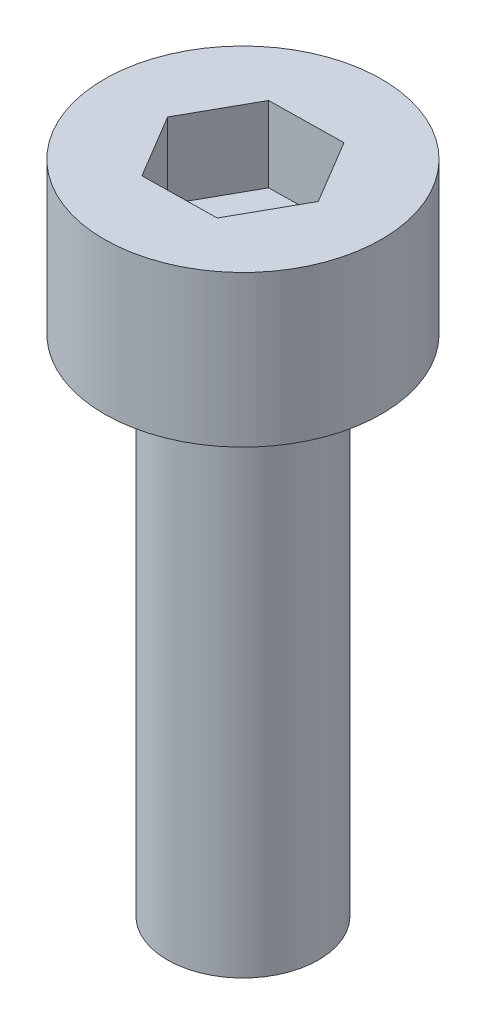
ISO-10303-21;
HEADER;
FILE_DESCRIPTION(('STEP AP214'),'2;1');
FILE_NAME('part.step','',(''),(''),'','','');
FILE_SCHEMA(('AUTOMOTIVE_DESIGN { 1 0 10303 214 1 1 1 1 }'));
ENDSEC;
DATA;
#1=APPLICATION_CONTEXT('core data for automotive mechanical design processes');
#2=APPLICATION_PROTOCOL_DEFINITION('international standard','automotive_design',2000,#1);
#3=PRODUCT_CONTEXT('',#1,'mechanical');
#4=PRODUCT('Part','Part','',(#3));
#5=PRODUCT_RELATED_PRODUCT_CATEGORY('part','',(#4));
#6=PRODUCT_DEFINITION_FORMATION('','',#4);
#7=PRODUCT_DEFINITION_CONTEXT('part definition',#1,'design');
#8=PRODUCT_DEFINITION('design','',#6,#7);
#9=PRODUCT_DEFINITION_SHAPE('','',#8);
#10=(LENGTH_UNIT() NAMED_UNIT(*) SI_UNIT(.MILLI.,.METRE.));
#11=(NAMED_UNIT(*) PLANE_ANGLE_UNIT() SI_UNIT($,.RADIAN.));
#12=(NAMED_UNIT(*) SI_UNIT($,.STERADIAN.) SOLID_ANGLE_UNIT());
#13=UNCERTAINTY_MEASURE_WITH_UNIT(LENGTH_MEASURE(1.E-05),#10,'distance_accuracy_value','');
#14=(GEOMETRIC_REPRESENTATION_CONTEXT(3) GLOBAL_UNCERTAINTY_ASSIGNED_CONTEXT((#13)) GLOBAL_UNIT_ASSIGNED_CONTEXT((#10,
#11,#12)) REPRESENTATION_CONTEXT('',''));
#15=CARTESIAN_POINT('',(0.,0.,0.));
#16=DIRECTION('',(0.,0.,1.));
#17=DIRECTION('',(1.,0.,0.));
#18=AXIS2_PLACEMENT_3D('',#15,#16,#17);
#19=CARTESIAN_POINT('',(0.,10.,0.));
#20=DIRECTION('',(0.,-1.,0.));
#21=DIRECTION('',(0.,0.,-1.));
#22=AXIS2_PLACEMENT_3D('',#19,#20,#21);
#23=CYLINDRICAL_SURFACE('',#22,1.5);
#24=CARTESIAN_POINT('',(0.,10.,0.));
#25=DIRECTION('',(0.,1.,0.));
#26=DIRECTION('',(0.,0.,1.));
#27=AXIS2_PLACEMENT_3D('',#24,#25,#26);
#28=CIRCLE('',#27,1.5);
#29=CARTESIAN_POINT('',(0.,10.,1.5));
#30=VERTEX_POINT('',#29);
#31=EDGE_CURVE('E11',#30,#30,#28,.T.);
#32=ORIENTED_EDGE('',*,*,#31,.F.);
#33=EDGE_LOOP('',(#32));
#34=FACE_BOUND('',#33,.T.);
#35=CARTESIAN_POINT('',(0.,0.,0.));
#36=DIRECTION('',(0.,1.,0.));
#37=DIRECTION('',(0.,0.,1.));
#38=AXIS2_PLACEMENT_3D('',#35,#36,#37);
#39=CIRCLE('',#38,1.5);
#40=CARTESIAN_POINT('',(0.,0.,1.5));
#41=VERTEX_POINT('',#40);
#42=EDGE_CURVE('E24',#41,#41,#39,.T.);
#43=ORIENTED_EDGE('',*,*,#42,.T.);
#44=EDGE_LOOP('',(#43));
#45=FACE_BOUND('',#44,.T.);
#46=ADVANCED_FACE('F17',(#34,#45),#23,.T.);
#47=CARTESIAN_POINT('',(0.,0.,0.));
#48=DIRECTION('',(0.,1.,0.));
#49=DIRECTION('',(0.,0.,1.));
#50=AXIS2_PLACEMENT_3D('',#47,#48,#49);
#51=PLANE('',#50);
#52=ORIENTED_EDGE('',*,*,#42,.F.);
#53=EDGE_LOOP('',(#52));
#54=FACE_BOUND('',#53,.T.);
#55=ADVANCED_FACE('F132',(#54),#51,.F.);
#56=CARTESIAN_POINT('',(0.,13.,0.));
#57=DIRECTION('',(0.,-1.,0.));
#58=DIRECTION('',(0.,0.,-1.));
#59=AXIS2_PLACEMENT_3D('',#56,#57,#58);
#60=CYLINDRICAL_SURFACE('',#59,2.75);
#61=CARTESIAN_POINT('',(0.,13.,0.));
#62=DIRECTION('',(0.,1.,0.));
#63=DIRECTION('',(0.,0.,1.));
#64=AXIS2_PLACEMENT_3D('',#61,#62,#63);
#65=CIRCLE('',#64,2.75);
#66=CARTESIAN_POINT('',(0.,13.,2.75));
#67=VERTEX_POINT('',#66);
#68=EDGE_CURVE('E126',#67,#67,#65,.T.);
#69=ORIENTED_EDGE('',*,*,#68,.F.);
#70=EDGE_LOOP('',(#69));
#71=FACE_BOUND('',#70,.T.);
#72=CARTESIAN_POINT('',(0.,10.,0.));
#73=DIRECTION('',(0.,1.,0.));
#74=DIRECTION('',(0.,0.,1.));
#75=AXIS2_PLACEMENT_3D('',#72,#73,#74);
#76=CIRCLE('',#75,2.75);
#77=CARTESIAN_POINT('',(0.,10.,2.75));
#78=VERTEX_POINT('',#77);
#79=EDGE_CURVE('E123',#78,#78,#76,.T.);
#80=ORIENTED_EDGE('',*,*,#79,.T.);
#81=EDGE_LOOP('',(#80));
#82=FACE_BOUND('',#81,.T.);
#83=ADVANCED_FACE('F134',(#71,#82),#60,.T.);
#84=CARTESIAN_POINT('',(0.,13.,0.));
#85=DIRECTION('',(0.,1.,0.));
#86=DIRECTION('',(0.,0.,1.));
#87=AXIS2_PLACEMENT_3D('',#84,#85,#86);
#88=PLANE('',#87);
#89=DIRECTION('',(0.999893086922528,0.,-0.0146224048821464));
#90=VECTOR('',#89,1.);
#91=CARTESIAN_POINT('',(-0.717399325967113,13.,1.28562755380473));
#92=LINE('',#91,#90);
#93=CARTESIAN_POINT('',(-0.717399325967113,13.,1.28562755380473));
#94=VERTEX_POINT('',#93);
#95=CARTESIAN_POINT('',(0.754686458416585,13.,1.26409981784772));
#96=VERTEX_POINT('',#95);
#97=EDGE_CURVE('E31',#94,#96,#92,.T.);
#98=ORIENTED_EDGE('',*,*,#97,.F.);
#99=DIRECTION('',(0.512609917553624,0.,0.858621611902278));
#100=VECTOR('',#99,1.);
#101=CARTESIAN_POINT('',(-1.4720857843837,13.,0.0215277359570126));
#102=LINE('',#101,#100);
#103=CARTESIAN_POINT('',(-1.4720857843837,13.,0.0215277359570126));
#104=VERTEX_POINT('',#103);
#105=EDGE_CURVE('E36',#104,#94,#102,.T.);
#106=ORIENTED_EDGE('',*,*,#105,.F.);
#107=DIRECTION('',(-0.487283169368904,0.,0.873244016784424));
#108=VECTOR('',#107,1.);
#109=CARTESIAN_POINT('',(-0.754686458416585,13.,-1.26409981784772));
#110=LINE('',#109,#108);
#111=CARTESIAN_POINT('',(-0.754686458416585,13.,-1.26409981784772));
#112=VERTEX_POINT('',#111);
#113=EDGE_CURVE('E118',#112,#104,#110,.T.);
#114=ORIENTED_EDGE('',*,*,#113,.F.);
#115=DIRECTION('',(-0.999893086922528,0.,0.0146224048821461));
#116=VECTOR('',#115,1.);
#117=CARTESIAN_POINT('',(0.717399325967112,13.,-1.28562755380473));
#118=LINE('',#117,#116);
#119=CARTESIAN_POINT('',(0.717399325967112,13.,-1.28562755380473));
#120=VERTEX_POINT('',#119);
#121=EDGE_CURVE('E115',#120,#112,#118,.T.);
#122=ORIENTED_EDGE('',*,*,#121,.F.);
#123=DIRECTION('',(-0.512609917553624,0.,-0.858621611902278));
#124=VECTOR('',#123,1.);
#125=CARTESIAN_POINT('',(1.4720857843837,13.,-0.0215277359570131));
#126=LINE('',#125,#124);
#127=CARTESIAN_POINT('',(1.4720857843837,13.,-0.0215277359570131));
#128=VERTEX_POINT('',#127);
#129=EDGE_CURVE('E113',#128,#120,#126,.T.);
#130=ORIENTED_EDGE('',*,*,#129,.F.);
#131=DIRECTION('',(0.487283169368904,0.,-0.873244016784425));
#132=VECTOR('',#131,1.);
#133=CARTESIAN_POINT('',(0.754686458416585,13.,1.26409981784772));
#134=LINE('',#133,#132);
#135=EDGE_CURVE('E87',#96,#128,#134,.T.);
#136=ORIENTED_EDGE('',*,*,#135,.F.);
#137=EDGE_LOOP('',(#98,#106,#114,#122,#130,#136));
#138=FACE_BOUND('',#137,.T.);
#139=ORIENTED_EDGE('',*,*,#68,.T.);
#140=EDGE_LOOP('',(#139));
#141=FACE_BOUND('',#140,.T.);
#142=ADVANCED_FACE('F140',(#138,#141),#88,.T.);
#143=CARTESIAN_POINT('',(0.,10.,0.));
#144=DIRECTION('',(0.,1.,0.));
#145=DIRECTION('',(0.,0.,1.));
#146=AXIS2_PLACEMENT_3D('',#143,#144,#145);
#147=PLANE('',#146);
#148=ORIENTED_EDGE('',*,*,#31,.T.);
#149=EDGE_LOOP('',(#148));
#150=FACE_BOUND('',#149,.T.);
#151=ORIENTED_EDGE('',*,*,#79,.F.);
#152=EDGE_LOOP('',(#151));
#153=FACE_BOUND('',#152,.T.);
#154=ADVANCED_FACE('F147',(#150,#153),#147,.F.);
#155=CARTESIAN_POINT('',(-0.717399325967113,11.5,1.28562755380473));
#156=DIRECTION('',(0.0146224048821464,0.,0.999893086922528));
#157=DIRECTION('',(0.999893086922528,0.,-0.0146224048821464));
#158=AXIS2_PLACEMENT_3D('',#155,#156,#157);
#159=PLANE('',#158);
#160=ORIENTED_EDGE('',*,*,#97,.T.);
#161=DIRECTION('',(0.,1.,0.));
#162=VECTOR('',#161,1.);
#163=CARTESIAN_POINT('',(0.754686458416585,11.5,1.26409981784772));
#164=LINE('',#163,#162);
#165=CARTESIAN_POINT('',(0.754686458416585,11.5,1.26409981784772));
#166=VERTEX_POINT('',#165);
#167=EDGE_CURVE('E110',#166,#96,#164,.T.);
#168=ORIENTED_EDGE('',*,*,#167,.F.);
#169=DIRECTION('',(0.999893086922528,0.,-0.0146224048821464));
#170=VECTOR('',#169,1.);
#171=CARTESIAN_POINT('',(-0.717399325967113,11.5,1.28562755380473));
#172=LINE('',#171,#170);
#173=CARTESIAN_POINT('',(-0.717399325967113,11.5,1.28562755380473));
#174=VERTEX_POINT('',#173);
#175=EDGE_CURVE('E91',#174,#166,#172,.T.);
#176=ORIENTED_EDGE('',*,*,#175,.F.);
#177=DIRECTION('',(0.,1.,0.));
#178=VECTOR('',#177,1.);
#179=CARTESIAN_POINT('',(-0.717399325967113,11.5,1.28562755380473));
#180=LINE('',#179,#178);
#181=EDGE_CURVE('E107',#174,#94,#180,.T.);
#182=ORIENTED_EDGE('',*,*,#181,.T.);
#183=EDGE_LOOP('',(#160,#168,#176,#182));
#184=FACE_BOUND('',#183,.T.);
#185=ADVANCED_FACE('F150',(#184),#159,.F.);
#186=CARTESIAN_POINT('',(-1.4720857843837,11.5,0.0215277359570126));
#187=DIRECTION('',(-0.858621611902278,0.,0.512609917553624));
#188=DIRECTION('',(0.512609917553624,0.,0.858621611902278));
#189=AXIS2_PLACEMENT_3D('',#186,#187,#188);
#190=PLANE('',#189);
#191=ORIENTED_EDGE('',*,*,#105,.T.);
#192=ORIENTED_EDGE('',*,*,#181,.F.);
#193=DIRECTION('',(0.512609917553624,0.,0.858621611902278));
#194=VECTOR('',#193,1.);
#195=CARTESIAN_POINT('',(-1.4720857843837,11.5,0.0215277359570126));
#196=LINE('',#195,#194);
#197=CARTESIAN_POINT('',(-1.4720857843837,11.5,0.0215277359570126));
#198=VERTEX_POINT('',#197);
#199=EDGE_CURVE('E105',#198,#174,#196,.T.);
#200=ORIENTED_EDGE('',*,*,#199,.F.);
#201=DIRECTION('',(0.,1.,0.));
#202=VECTOR('',#201,1.);
#203=CARTESIAN_POINT('',(-1.4720857843837,11.5,0.0215277359570126));
#204=LINE('',#203,#202);
#205=EDGE_CURVE('E103',#198,#104,#204,.T.);
#206=ORIENTED_EDGE('',*,*,#205,.T.);
#207=EDGE_LOOP('',(#191,#192,#200,#206));
#208=FACE_BOUND('',#207,.T.);
#209=ADVANCED_FACE('F154',(#208),#190,.F.);
#210=CARTESIAN_POINT('',(-0.754686458416585,11.5,-1.26409981784772));
#211=DIRECTION('',(-0.873244016784425,0.,-0.487283169368904));
#212=DIRECTION('',(-0.487283169368904,0.,0.873244016784425));
#213=AXIS2_PLACEMENT_3D('',#210,#211,#212);
#214=PLANE('',#213);
#215=ORIENTED_EDGE('',*,*,#113,.T.);
#216=ORIENTED_EDGE('',*,*,#205,.F.);
#217=DIRECTION('',(-0.487283169368904,0.,0.873244016784424));
#218=VECTOR('',#217,1.);
#219=CARTESIAN_POINT('',(-0.754686458416585,11.5,-1.26409981784772));
#220=LINE('',#219,#218);
#221=CARTESIAN_POINT('',(-0.754686458416585,11.5,-1.26409981784772));
#222=VERTEX_POINT('',#221);
#223=EDGE_CURVE('E100',#222,#198,#220,.T.);
#224=ORIENTED_EDGE('',*,*,#223,.F.);
#225=DIRECTION('',(0.,1.,0.));
#226=VECTOR('',#225,1.);
#227=CARTESIAN_POINT('',(-0.754686458416585,11.5,-1.26409981784772));
#228=LINE('',#227,#226);
#229=EDGE_CURVE('E97',#222,#112,#228,.T.);
#230=ORIENTED_EDGE('',*,*,#229,.T.);
#231=EDGE_LOOP('',(#215,#216,#224,#230));
#232=FACE_BOUND('',#231,.T.);
#233=ADVANCED_FACE('F158',(#232),#214,.F.);
#234=CARTESIAN_POINT('',(0.717399325967112,11.5,-1.28562755380473));
#235=DIRECTION('',(-0.0146224048821461,0.,-0.999893086922528));
#236=DIRECTION('',(-0.999893086922528,0.,0.0146224048821461));
#237=AXIS2_PLACEMENT_3D('',#234,#235,#236);
#238=PLANE('',#237);
#239=ORIENTED_EDGE('',*,*,#121,.T.);
#240=ORIENTED_EDGE('',*,*,#229,.F.);
#241=DIRECTION('',(-0.999893086922528,0.,0.0146224048821461));
#242=VECTOR('',#241,1.);
#243=CARTESIAN_POINT('',(0.717399325967112,11.5,-1.28562755380473));
#244=LINE('',#243,#242);
#245=CARTESIAN_POINT('',(0.717399325967112,11.5,-1.28562755380473));
#246=VERTEX_POINT('',#245);
#247=EDGE_CURVE('E95',#246,#222,#244,.T.);
#248=ORIENTED_EDGE('',*,*,#247,.F.);
#249=DIRECTION('',(0.,1.,0.));
#250=VECTOR('',#249,1.);
#251=CARTESIAN_POINT('',(0.717399325967112,11.5,-1.28562755380473));
#252=LINE('',#251,#250);
#253=EDGE_CURVE('E76',#246,#120,#252,.T.);
#254=ORIENTED_EDGE('',*,*,#253,.T.);
#255=EDGE_LOOP('',(#239,#240,#248,#254));
#256=FACE_BOUND('',#255,.T.);
#257=ADVANCED_FACE('F162',(#256),#238,.F.);
#258=CARTESIAN_POINT('',(1.4720857843837,11.5,-0.0215277359570131));
#259=DIRECTION('',(0.858621611902278,0.,-0.512609917553624));
#260=DIRECTION('',(-0.512609917553624,0.,-0.858621611902278));
#261=AXIS2_PLACEMENT_3D('',#258,#259,#260);
#262=PLANE('',#261);
#263=ORIENTED_EDGE('',*,*,#129,.T.);
#264=ORIENTED_EDGE('',*,*,#253,.F.);
#265=DIRECTION('',(-0.512609917553624,0.,-0.858621611902278));
#266=VECTOR('',#265,1.);
#267=CARTESIAN_POINT('',(1.4720857843837,11.5,-0.0215277359570131));
#268=LINE('',#267,#266);
#269=CARTESIAN_POINT('',(1.4720857843837,11.5,-0.0215277359570131));
#270=VERTEX_POINT('',#269);
#271=EDGE_CURVE('E69',#270,#246,#268,.T.);
#272=ORIENTED_EDGE('',*,*,#271,.F.);
#273=DIRECTION('',(0.,1.,0.));
#274=VECTOR('',#273,1.);
#275=CARTESIAN_POINT('',(1.4720857843837,11.5,-0.0215277359570131));
#276=LINE('',#275,#274);
#277=EDGE_CURVE('E73',#270,#128,#276,.T.);
#278=ORIENTED_EDGE('',*,*,#277,.T.);
#279=EDGE_LOOP('',(#263,#264,#272,#278));
#280=FACE_BOUND('',#279,.T.);
#281=ADVANCED_FACE('F72',(#280),#262,.F.);
#282=CARTESIAN_POINT('',(0.754686458416585,11.5,1.26409981784772));
#283=DIRECTION('',(0.873244016784425,0.,0.487283169368904));
#284=DIRECTION('',(0.487283169368904,0.,-0.873244016784425));
#285=AXIS2_PLACEMENT_3D('',#282,#283,#284);
#286=PLANE('',#285);
#287=ORIENTED_EDGE('',*,*,#135,.T.);
#288=ORIENTED_EDGE('',*,*,#277,.F.);
#289=DIRECTION('',(0.487283169368904,0.,-0.873244016784425));
#290=VECTOR('',#289,1.);
#291=CARTESIAN_POINT('',(0.754686458416585,11.5,1.26409981784772));
#292=LINE('',#291,#290);
#293=EDGE_CURVE('E85',#166,#270,#292,.T.);
#294=ORIENTED_EDGE('',*,*,#293,.F.);
#295=ORIENTED_EDGE('',*,*,#167,.T.);
#296=EDGE_LOOP('',(#287,#288,#294,#295));
#297=FACE_BOUND('',#296,.T.);
#298=ADVANCED_FACE('F83',(#297),#286,.F.);
#299=CARTESIAN_POINT('',(0.,11.5,0.));
#300=DIRECTION('',(0.,1.,0.));
#301=DIRECTION('',(0.,0.,1.));
#302=AXIS2_PLACEMENT_3D('',#299,#300,#301);
#303=PLANE('',#302);
#304=ORIENTED_EDGE('',*,*,#175,.T.);
#305=ORIENTED_EDGE('',*,*,#293,.T.);
#306=ORIENTED_EDGE('',*,*,#271,.T.);
#307=ORIENTED_EDGE('',*,*,#247,.T.);
#308=ORIENTED_EDGE('',*,*,#223,.T.);
#309=ORIENTED_EDGE('',*,*,#199,.T.);
#310=EDGE_LOOP('',(#304,#305,#306,#307,#308,#309));
#311=FACE_BOUND('',#310,.T.);
#312=ADVANCED_FACE('F89',(#311),#303,.T.);
#313=CLOSED_SHELL('',(#46,#55,#83,#142,#154,#185,#209,#233,#257,#281,#298,#312));
#314=MANIFOLD_SOLID_BREP('B1',#313);
#315=ADVANCED_BREP_SHAPE_REPRESENTATION('',(#18,#314),#14);
#316=SHAPE_DEFINITION_REPRESENTATION(#9,#315);
ENDSEC;
END-ISO-10303-21;
